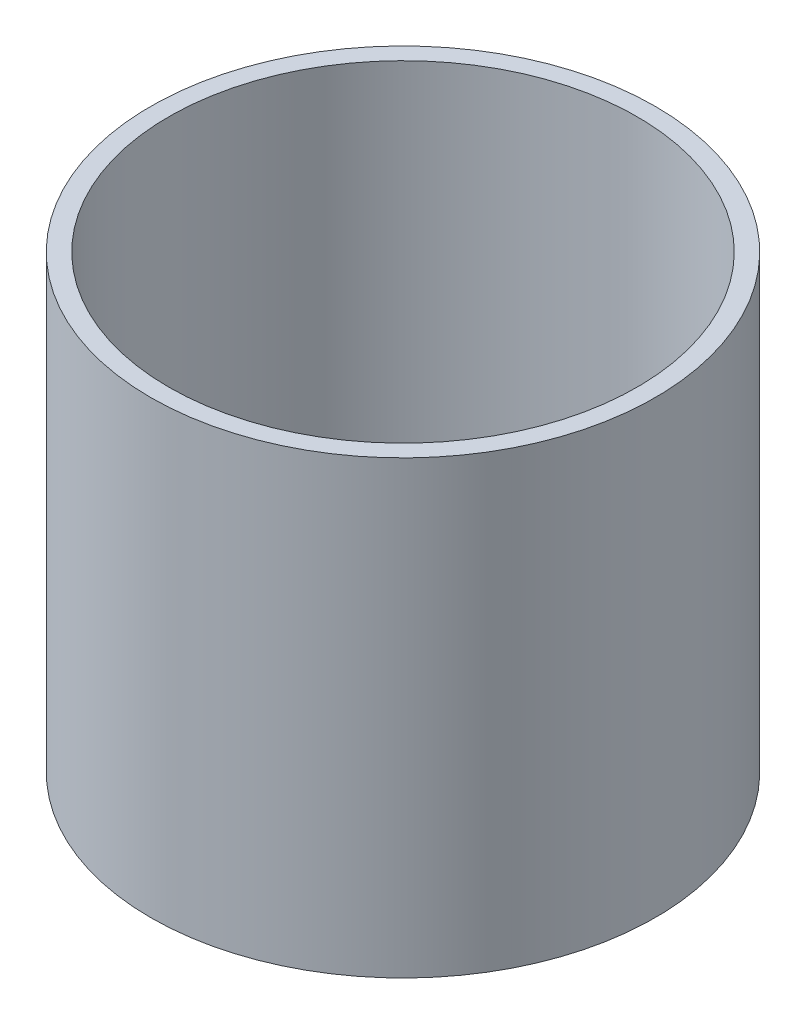
ISO-10303-21;
HEADER;
FILE_DESCRIPTION(('STEP AP214'),'2;1');
FILE_NAME('part.step','',(''),(''),'','','');
FILE_SCHEMA(('AUTOMOTIVE_DESIGN { 1 0 10303 214 1 1 1 1 }'));
ENDSEC;
DATA;
#1=APPLICATION_CONTEXT('core data for automotive mechanical design processes');
#2=APPLICATION_PROTOCOL_DEFINITION('international standard','automotive_design',2000,#1);
#3=PRODUCT_CONTEXT('',#1,'mechanical');
#4=PRODUCT('Part','Part','',(#3));
#5=PRODUCT_RELATED_PRODUCT_CATEGORY('part','',(#4));
#6=PRODUCT_DEFINITION_FORMATION('','',#4);
#7=PRODUCT_DEFINITION_CONTEXT('part definition',#1,'design');
#8=PRODUCT_DEFINITION('design','',#6,#7);
#9=PRODUCT_DEFINITION_SHAPE('','',#8);
#10=(LENGTH_UNIT() NAMED_UNIT(*) SI_UNIT(.MILLI.,.METRE.));
#11=(NAMED_UNIT(*) PLANE_ANGLE_UNIT() SI_UNIT($,.RADIAN.));
#12=(NAMED_UNIT(*) SI_UNIT($,.STERADIAN.) SOLID_ANGLE_UNIT());
#13=UNCERTAINTY_MEASURE_WITH_UNIT(LENGTH_MEASURE(1.E-05),#10,'distance_accuracy_value','');
#14=(GEOMETRIC_REPRESENTATION_CONTEXT(3) GLOBAL_UNCERTAINTY_ASSIGNED_CONTEXT((#13)) GLOBAL_UNIT_ASSIGNED_CONTEXT((#10,
#11,#12)) REPRESENTATION_CONTEXT('',''));
#15=CARTESIAN_POINT('',(0.,0.,0.));
#16=DIRECTION('',(0.,0.,1.));
#17=DIRECTION('',(1.,0.,0.));
#18=AXIS2_PLACEMENT_3D('',#15,#16,#17);
#19=CARTESIAN_POINT('',(0.,25.,0.));
#20=DIRECTION('',(0.,1.,0.));
#21=DIRECTION('',(0.,0.,1.));
#22=AXIS2_PLACEMENT_3D('',#19,#20,#21);
#23=PLANE('',#22);
#24=CARTESIAN_POINT('',(0.,25.,0.));
#25=DIRECTION('',(0.,1.,0.));
#26=DIRECTION('',(0.,0.,1.));
#27=AXIS2_PLACEMENT_3D('',#24,#25,#26);
#28=CIRCLE('',#27,14.);
#29=CARTESIAN_POINT('',(0.,25.,14.));
#30=VERTEX_POINT('',#29);
#31=EDGE_CURVE('E10',#30,#30,#28,.T.);
#32=ORIENTED_EDGE('',*,*,#31,.T.);
#33=EDGE_LOOP('',(#32));
#34=FACE_BOUND('',#33,.T.);
#35=CARTESIAN_POINT('',(0.,25.,0.));
#36=DIRECTION('',(0.,1.,0.));
#37=DIRECTION('',(0.,0.,1.));
#38=AXIS2_PLACEMENT_3D('',#35,#36,#37);
#39=CIRCLE('',#38,13.);
#40=CARTESIAN_POINT('',(0.,25.,13.));
#41=VERTEX_POINT('',#40);
#42=EDGE_CURVE('E42',#41,#41,#39,.T.);
#43=ORIENTED_EDGE('',*,*,#42,.F.);
#44=EDGE_LOOP('',(#43));
#45=FACE_BOUND('',#44,.T.);
#46=ADVANCED_FACE('F31',(#34,#45),#23,.T.);
#47=CARTESIAN_POINT('',(0.,0.,0.));
#48=DIRECTION('',(0.,1.,0.));
#49=DIRECTION('',(0.,0.,1.));
#50=AXIS2_PLACEMENT_3D('',#47,#48,#49);
#51=PLANE('',#50);
#52=CARTESIAN_POINT('',(0.,0.,0.));
#53=DIRECTION('',(0.,1.,0.));
#54=DIRECTION('',(0.,0.,1.));
#55=AXIS2_PLACEMENT_3D('',#52,#53,#54);
#56=CIRCLE('',#55,14.);
#57=CARTESIAN_POINT('',(0.,0.,14.));
#58=VERTEX_POINT('',#57);
#59=EDGE_CURVE('E35',#58,#58,#56,.T.);
#60=ORIENTED_EDGE('',*,*,#59,.F.);
#61=EDGE_LOOP('',(#60));
#62=FACE_BOUND('',#61,.T.);
#63=CARTESIAN_POINT('',(0.,0.,0.));
#64=DIRECTION('',(0.,1.,0.));
#65=DIRECTION('',(0.,0.,1.));
#66=AXIS2_PLACEMENT_3D('',#63,#64,#65);
#67=CIRCLE('',#66,13.);
#68=CARTESIAN_POINT('',(0.,0.,13.));
#69=VERTEX_POINT('',#68);
#70=EDGE_CURVE('E44',#69,#69,#67,.T.);
#71=ORIENTED_EDGE('',*,*,#70,.T.);
#72=EDGE_LOOP('',(#71));
#73=FACE_BOUND('',#72,.T.);
#74=ADVANCED_FACE('F54',(#62,#73),#51,.F.);
#75=CARTESIAN_POINT('',(0.,25.,0.));
#76=DIRECTION('',(0.,-1.,0.));
#77=DIRECTION('',(0.,0.,-1.));
#78=AXIS2_PLACEMENT_3D('',#75,#76,#77);
#79=CYLINDRICAL_SURFACE('',#78,14.);
#80=ORIENTED_EDGE('',*,*,#31,.F.);
#81=EDGE_LOOP('',(#80));
#82=FACE_BOUND('',#81,.T.);
#83=ORIENTED_EDGE('',*,*,#59,.T.);
#84=EDGE_LOOP('',(#83));
#85=FACE_BOUND('',#84,.T.);
#86=ADVANCED_FACE('F33',(#82,#85),#79,.T.);
#87=CARTESIAN_POINT('',(0.,25.,0.));
#88=DIRECTION('',(0.,-1.,0.));
#89=DIRECTION('',(0.,0.,-1.));
#90=AXIS2_PLACEMENT_3D('',#87,#88,#89);
#91=CYLINDRICAL_SURFACE('',#90,13.);
#92=ORIENTED_EDGE('',*,*,#42,.T.);
#93=EDGE_LOOP('',(#92));
#94=FACE_BOUND('',#93,.T.);
#95=ORIENTED_EDGE('',*,*,#70,.F.);
#96=EDGE_LOOP('',(#95));
#97=FACE_BOUND('',#96,.T.);
#98=ADVANCED_FACE('F50',(#94,#97),#91,.F.);
#99=CLOSED_SHELL('',(#46,#74,#86,#98));
#100=MANIFOLD_SOLID_BREP('B2',#99);
#101=ADVANCED_BREP_SHAPE_REPRESENTATION('',(#18,#100),#14);
#102=SHAPE_DEFINITION_REPRESENTATION(#9,#101);
ENDSEC;
END-ISO-10303-21;
